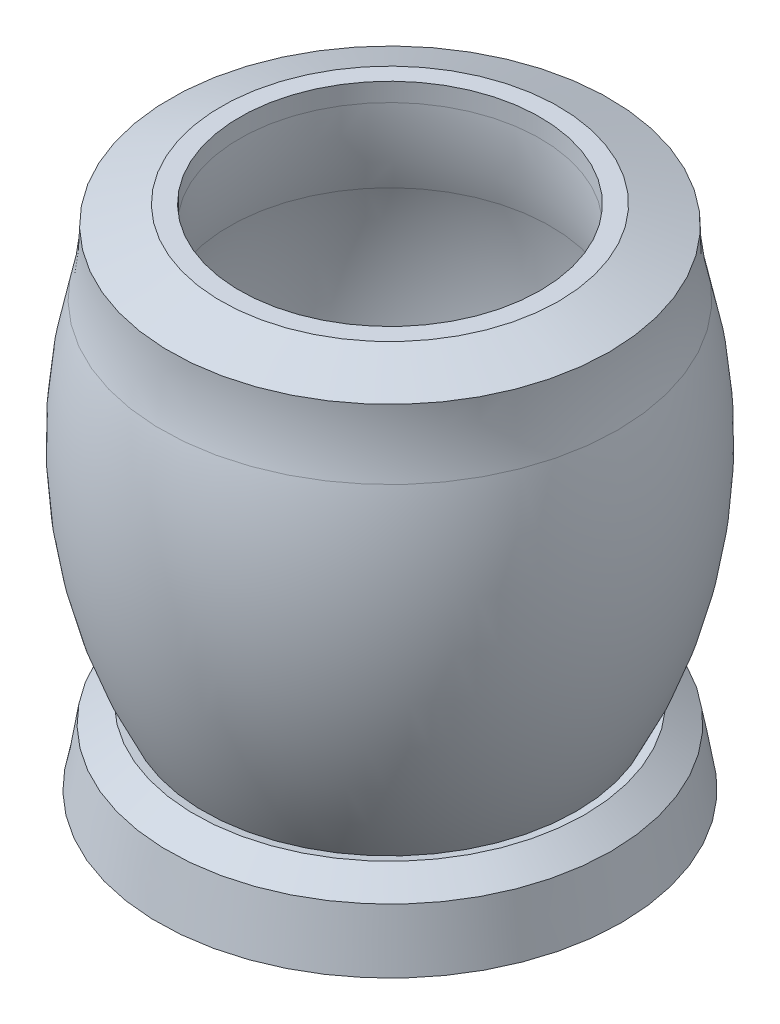
ISO-10303-21;
HEADER;
FILE_DESCRIPTION(('STEP AP214'),'2;1');
FILE_NAME('part.step','',(''),(''),'','','');
FILE_SCHEMA(('AUTOMOTIVE_DESIGN { 1 0 10303 214 1 1 1 1 }'));
ENDSEC;
DATA;
#1=APPLICATION_CONTEXT('core data for automotive mechanical design processes');
#2=APPLICATION_PROTOCOL_DEFINITION('international standard','automotive_design',2000,#1);
#3=PRODUCT_CONTEXT('',#1,'mechanical');
#4=PRODUCT('Part','Part','',(#3));
#5=PRODUCT_RELATED_PRODUCT_CATEGORY('part','',(#4));
#6=PRODUCT_DEFINITION_FORMATION('','',#4);
#7=PRODUCT_DEFINITION_CONTEXT('part definition',#1,'design');
#8=PRODUCT_DEFINITION('design','',#6,#7);
#9=PRODUCT_DEFINITION_SHAPE('','',#8);
#10=(LENGTH_UNIT() NAMED_UNIT(*) SI_UNIT(.MILLI.,.METRE.));
#11=(NAMED_UNIT(*) PLANE_ANGLE_UNIT() SI_UNIT($,.RADIAN.));
#12=(NAMED_UNIT(*) SI_UNIT($,.STERADIAN.) SOLID_ANGLE_UNIT());
#13=UNCERTAINTY_MEASURE_WITH_UNIT(LENGTH_MEASURE(1.E-05),#10,'distance_accuracy_value','');
#14=(GEOMETRIC_REPRESENTATION_CONTEXT(3) GLOBAL_UNCERTAINTY_ASSIGNED_CONTEXT((#13)) GLOBAL_UNIT_ASSIGNED_CONTEXT((#10,
#11,#12)) REPRESENTATION_CONTEXT('',''));
#15=CARTESIAN_POINT('',(0.,0.,0.));
#16=DIRECTION('',(0.,0.,1.));
#17=DIRECTION('',(1.,0.,0.));
#18=AXIS2_PLACEMENT_3D('',#15,#16,#17);
#19=CARTESIAN_POINT('',(0.,6.88073938927536,0.));
#20=DIRECTION('',(0.,1.,0.));
#21=DIRECTION('',(-1.,0.,0.));
#22=AXIS2_PLACEMENT_3D('',#19,#20,#21);
#23=CONICAL_SURFACE('',#22,3.937,1.39626340159546);
#24=CARTESIAN_POINT('',(0.,7.51509678354031,0.));
#25=DIRECTION('',(0.,-1.,0.));
#26=DIRECTION('',(1.,0.,0.));
#27=AXIS2_PLACEMENT_3D('',#24,#25,#26);
#28=CIRCLE('',#27,7.5346195572348);
#29=CARTESIAN_POINT('',(7.5346195572348,7.51509678354031,0.));
#30=VERTEX_POINT('',#29);
#31=EDGE_CURVE('E10',#30,#30,#28,.T.);
#32=ORIENTED_EDGE('',*,*,#31,.F.);
#33=EDGE_LOOP('',(#32));
#34=FACE_BOUND('',#33,.T.);
#35=CARTESIAN_POINT('',(0.,6.88073938927536,0.));
#36=DIRECTION('',(0.,-1.,0.));
#37=DIRECTION('',(1.,0.,0.));
#38=AXIS2_PLACEMENT_3D('',#35,#36,#37);
#39=CIRCLE('',#38,3.937);
#40=CARTESIAN_POINT('',(3.937,6.88073938927536,0.));
#41=VERTEX_POINT('',#40);
#42=EDGE_CURVE('E76',#41,#41,#39,.T.);
#43=ORIENTED_EDGE('',*,*,#42,.T.);
#44=EDGE_LOOP('',(#43));
#45=FACE_BOUND('',#44,.T.);
#46=ADVANCED_FACE('F33',(#34,#45),#23,.F.);
#47=CARTESIAN_POINT('',(0.,16.113042130845,0.));
#48=DIRECTION('',(0.,-1.,0.));
#49=DIRECTION('',(1.,0.,0.));
#50=AXIS2_PLACEMENT_3D('',#47,#48,#49);
#51=DEGENERATE_TOROIDAL_SURFACE('',#50,12.954,22.2195453499018,.F.);
#52=CARTESIAN_POINT('',(0.,21.6966178549877,0.));
#53=DIRECTION('',(0.,-1.,0.));
#54=DIRECTION('',(1.,0.,0.));
#55=AXIS2_PLACEMENT_3D('',#52,#53,#54);
#56=CIRCLE('',#55,8.55255429605372);
#57=CARTESIAN_POINT('',(8.55255429605372,21.6966178549877,0.));
#58=VERTEX_POINT('',#57);
#59=EDGE_CURVE('E39',#58,#58,#56,.T.);
#60=ORIENTED_EDGE('',*,*,#59,.F.);
#61=EDGE_LOOP('',(#60));
#62=FACE_BOUND('',#61,.T.);
#63=ORIENTED_EDGE('',*,*,#31,.T.);
#64=EDGE_LOOP('',(#63));
#65=FACE_BOUND('',#64,.T.);
#66=ADVANCED_FACE('F143',(#62,#65),#51,.T.);
#67=CARTESIAN_POINT('',(0.,26.01595,0.));
#68=DIRECTION('',(0.,-1.,0.));
#69=DIRECTION('',(1.,0.,0.));
#70=AXIS2_PLACEMENT_3D('',#67,#68,#69);
#71=TOROIDAL_SURFACE('',#70,25.1895546500982,17.1885546500982);
#72=CARTESIAN_POINT('',(0.,26.01595,0.));
#73=DIRECTION('',(0.,-1.,0.));
#74=DIRECTION('',(1.,0.,0.));
#75=AXIS2_PLACEMENT_3D('',#72,#73,#74);
#76=CIRCLE('',#75,8.001);
#77=CARTESIAN_POINT('',(8.001,26.01595,0.));
#78=VERTEX_POINT('',#77);
#79=EDGE_CURVE('E43',#78,#78,#76,.T.);
#80=ORIENTED_EDGE('',*,*,#79,.F.);
#81=EDGE_LOOP('',(#80));
#82=FACE_BOUND('',#81,.T.);
#83=ORIENTED_EDGE('',*,*,#59,.T.);
#84=EDGE_LOOP('',(#83));
#85=FACE_BOUND('',#84,.T.);
#86=ADVANCED_FACE('F138',(#82,#85),#71,.T.);
#87=CARTESIAN_POINT('',(0.,0.,0.));
#88=DIRECTION('',(0.,-1.,0.));
#89=DIRECTION('',(1.,0.,0.));
#90=AXIS2_PLACEMENT_3D('',#87,#88,#89);
#91=CYLINDRICAL_SURFACE('',#90,8.001);
#92=CARTESIAN_POINT('',(0.,27.0002,0.));
#93=DIRECTION('',(0.,-1.,0.));
#94=DIRECTION('',(1.,0.,0.));
#95=AXIS2_PLACEMENT_3D('',#92,#93,#94);
#96=CIRCLE('',#95,8.001);
#97=CARTESIAN_POINT('',(8.001,27.0002,0.));
#98=VERTEX_POINT('',#97);
#99=EDGE_CURVE('E47',#98,#98,#96,.T.);
#100=ORIENTED_EDGE('',*,*,#99,.F.);
#101=EDGE_LOOP('',(#100));
#102=FACE_BOUND('',#101,.T.);
#103=ORIENTED_EDGE('',*,*,#79,.T.);
#104=EDGE_LOOP('',(#103));
#105=FACE_BOUND('',#104,.T.);
#106=ADVANCED_FACE('F132',(#102,#105),#91,.F.);
#107=CARTESIAN_POINT('',(-8.98525,27.0002,0.));
#108=DIRECTION('',(0.,-1.,0.));
#109=DIRECTION('',(1.,0.,0.));
#110=AXIS2_PLACEMENT_3D('',#107,#108,#109);
#111=PLANE('',#110);
#112=CARTESIAN_POINT('',(0.,27.0002,0.));
#113=DIRECTION('',(0.,-1.,0.));
#114=DIRECTION('',(1.,0.,0.));
#115=AXIS2_PLACEMENT_3D('',#112,#113,#114);
#116=CIRCLE('',#115,8.98525);
#117=CARTESIAN_POINT('',(8.98525,27.0002,0.));
#118=VERTEX_POINT('',#117);
#119=EDGE_CURVE('E52',#118,#118,#116,.T.);
#120=ORIENTED_EDGE('',*,*,#119,.F.);
#121=EDGE_LOOP('',(#120));
#122=FACE_BOUND('',#121,.T.);
#123=ORIENTED_EDGE('',*,*,#99,.T.);
#124=EDGE_LOOP('',(#123));
#125=FACE_BOUND('',#124,.T.);
#126=ADVANCED_FACE('F126',(#122,#125),#111,.F.);
#127=CARTESIAN_POINT('',(0.,27.0002,0.));
#128=DIRECTION('',(0.,-1.,0.));
#129=DIRECTION('',(1.,0.,0.));
#130=AXIS2_PLACEMENT_3D('',#127,#128,#129);
#131=CONICAL_SURFACE('',#130,8.98525,1.22173047639603);
#132=CARTESIAN_POINT('',(0.,26.01595,0.));
#133=DIRECTION('',(0.,-1.,0.));
#134=DIRECTION('',(1.,0.,0.));
#135=AXIS2_PLACEMENT_3D('',#132,#133,#134);
#136=CIRCLE('',#135,11.6894546500982);
#137=CARTESIAN_POINT('',(11.6894546500982,26.01595,0.));
#138=VERTEX_POINT('',#137);
#139=EDGE_CURVE('E55',#138,#138,#136,.T.);
#140=ORIENTED_EDGE('',*,*,#139,.F.);
#141=EDGE_LOOP('',(#140));
#142=FACE_BOUND('',#141,.T.);
#143=ORIENTED_EDGE('',*,*,#119,.T.);
#144=EDGE_LOOP('',(#143));
#145=FACE_BOUND('',#144,.T.);
#146=ADVANCED_FACE('F120',(#142,#145),#131,.T.);
#147=CARTESIAN_POINT('',(0.,26.01595,0.));
#148=DIRECTION('',(0.,-1.,0.));
#149=DIRECTION('',(1.,0.,0.));
#150=AXIS2_PLACEMENT_3D('',#147,#148,#149);
#151=TOROIDAL_SURFACE('',#150,25.1895546500982,13.5001);
#152=CARTESIAN_POINT('',(0.,22.6234939687684,0.));
#153=DIRECTION('',(0.,-1.,0.));
#154=DIRECTION('',(1.,0.,0.));
#155=AXIS2_PLACEMENT_3D('',#152,#153,#154);
#156=CIRCLE('',#155,12.1226521064133);
#157=CARTESIAN_POINT('',(12.1226521064133,22.6234939687684,0.));
#158=VERTEX_POINT('',#157);
#159=EDGE_CURVE('E58',#158,#158,#156,.T.);
#160=ORIENTED_EDGE('',*,*,#159,.F.);
#161=EDGE_LOOP('',(#160));
#162=FACE_BOUND('',#161,.T.);
#163=ORIENTED_EDGE('',*,*,#139,.T.);
#164=EDGE_LOOP('',(#163));
#165=FACE_BOUND('',#164,.T.);
#166=ADVANCED_FACE('F114',(#162,#165),#151,.F.);
#167=CARTESIAN_POINT('',(0.,16.113042130845,0.));
#168=DIRECTION('',(0.,-1.,0.));
#169=DIRECTION('',(1.,0.,0.));
#170=AXIS2_PLACEMENT_3D('',#167,#168,#169);
#171=DEGENERATE_TOROIDAL_SURFACE('',#170,12.954,25.908,.F.);
#172=CARTESIAN_POINT('',(0.,3.937,0.));
#173=DIRECTION('',(0.,-1.,0.));
#174=DIRECTION('',(1.,0.,0.));
#175=AXIS2_PLACEMENT_3D('',#172,#173,#174);
#176=CIRCLE('',#175,9.91450371204657);
#177=CARTESIAN_POINT('',(9.91450371204657,3.937,0.));
#178=VERTEX_POINT('',#177);
#179=EDGE_CURVE('E61',#178,#178,#176,.T.);
#180=ORIENTED_EDGE('',*,*,#179,.F.);
#181=EDGE_LOOP('',(#180));
#182=FACE_BOUND('',#181,.T.);
#183=ORIENTED_EDGE('',*,*,#159,.T.);
#184=EDGE_LOOP('',(#183));
#185=FACE_BOUND('',#184,.T.);
#186=ADVANCED_FACE('F108',(#182,#185),#171,.F.);
#187=CARTESIAN_POINT('',(0.,3.937,0.));
#188=DIRECTION('',(0.,1.,0.));
#189=DIRECTION('',(-1.,0.,0.));
#190=AXIS2_PLACEMENT_3D('',#187,#188,#189);
#191=CONICAL_SURFACE('',#190,9.91450371204657,1.39626340159546);
#192=CARTESIAN_POINT('',(0.,4.01877566871503,0.));
#193=DIRECTION('',(0.,-1.,0.));
#194=DIRECTION('',(1.,0.,0.));
#195=AXIS2_PLACEMENT_3D('',#192,#193,#194);
#196=CIRCLE('',#195,10.3782765753172);
#197=CARTESIAN_POINT('',(10.3782765753172,4.01877566871503,0.));
#198=VERTEX_POINT('',#197);
#199=EDGE_CURVE('E64',#198,#198,#196,.T.);
#200=ORIENTED_EDGE('',*,*,#199,.F.);
#201=EDGE_LOOP('',(#200));
#202=FACE_BOUND('',#201,.T.);
#203=ORIENTED_EDGE('',*,*,#179,.T.);
#204=EDGE_LOOP('',(#203));
#205=FACE_BOUND('',#204,.T.);
#206=ADVANCED_FACE('F102',(#202,#205),#191,.F.);
#207=CARTESIAN_POINT('',(0.,4.01877566871503,0.));
#208=DIRECTION('',(0.,-1.,0.));
#209=DIRECTION('',(1.,0.,0.));
#210=AXIS2_PLACEMENT_3D('',#207,#208,#209);
#211=CONICAL_SURFACE('',#210,10.3782765753172,0.959931088596888);
#212=CARTESIAN_POINT('',(0.,3.03452566871503,0.));
#213=DIRECTION('',(0.,-1.,0.));
#214=DIRECTION('',(1.,0.,0.));
#215=AXIS2_PLACEMENT_3D('',#212,#213,#214);
#216=CIRCLE('',#215,11.7839312509531);
#217=CARTESIAN_POINT('',(11.7839312509531,3.03452566871503,0.));
#218=VERTEX_POINT('',#217);
#219=EDGE_CURVE('E67',#218,#218,#216,.T.);
#220=ORIENTED_EDGE('',*,*,#219,.F.);
#221=EDGE_LOOP('',(#220));
#222=FACE_BOUND('',#221,.T.);
#223=ORIENTED_EDGE('',*,*,#199,.T.);
#224=EDGE_LOOP('',(#223));
#225=FACE_BOUND('',#224,.T.);
#226=ADVANCED_FACE('F96',(#222,#225),#211,.T.);
#227=CARTESIAN_POINT('',(0.,3.03452566871503,0.));
#228=DIRECTION('',(0.,-1.,0.));
#229=DIRECTION('',(1.,0.,0.));
#230=AXIS2_PLACEMENT_3D('',#227,#228,#229);
#231=CONICAL_SURFACE('',#230,11.7839312509531,0.174532925199438);
#232=CARTESIAN_POINT('',(0.,0.,0.));
#233=DIRECTION('',(0.,-1.,0.));
#234=DIRECTION('',(1.,0.,0.));
#235=AXIS2_PLACEMENT_3D('',#232,#233,#234);
#236=CIRCLE('',#235,12.319);
#237=CARTESIAN_POINT('',(12.319,0.,0.));
#238=VERTEX_POINT('',#237);
#239=EDGE_CURVE('E70',#238,#238,#236,.T.);
#240=ORIENTED_EDGE('',*,*,#239,.F.);
#241=EDGE_LOOP('',(#240));
#242=FACE_BOUND('',#241,.T.);
#243=ORIENTED_EDGE('',*,*,#219,.T.);
#244=EDGE_LOOP('',(#243));
#245=FACE_BOUND('',#244,.T.);
#246=ADVANCED_FACE('F90',(#242,#245),#231,.T.);
#247=CARTESIAN_POINT('',(-3.937,0.,0.));
#248=DIRECTION('',(0.,1.,0.));
#249=DIRECTION('',(-1.,0.,0.));
#250=AXIS2_PLACEMENT_3D('',#247,#248,#249);
#251=PLANE('',#250);
#252=CARTESIAN_POINT('',(0.,0.,0.));
#253=DIRECTION('',(0.,-1.,0.));
#254=DIRECTION('',(1.,0.,0.));
#255=AXIS2_PLACEMENT_3D('',#252,#253,#254);
#256=CIRCLE('',#255,3.937);
#257=CARTESIAN_POINT('',(3.937,0.,0.));
#258=VERTEX_POINT('',#257);
#259=EDGE_CURVE('E73',#258,#258,#256,.T.);
#260=ORIENTED_EDGE('',*,*,#259,.F.);
#261=EDGE_LOOP('',(#260));
#262=FACE_BOUND('',#261,.T.);
#263=ORIENTED_EDGE('',*,*,#239,.T.);
#264=EDGE_LOOP('',(#263));
#265=FACE_BOUND('',#264,.T.);
#266=ADVANCED_FACE('F84',(#262,#265),#251,.F.);
#267=CARTESIAN_POINT('',(0.,0.,0.));
#268=DIRECTION('',(0.,-1.,0.));
#269=DIRECTION('',(1.,0.,0.));
#270=AXIS2_PLACEMENT_3D('',#267,#268,#269);
#271=CYLINDRICAL_SURFACE('',#270,3.937);
#272=ORIENTED_EDGE('',*,*,#42,.F.);
#273=EDGE_LOOP('',(#272));
#274=FACE_BOUND('',#273,.T.);
#275=ORIENTED_EDGE('',*,*,#259,.T.);
#276=EDGE_LOOP('',(#275));
#277=FACE_BOUND('',#276,.T.);
#278=ADVANCED_FACE('F81',(#274,#277),#271,.F.);
#279=CLOSED_SHELL('',(#46,#66,#86,#106,#126,#146,#166,#186,#206,#226,#246,#266,#278));
#280=MANIFOLD_SOLID_BREP('B2',#279);
#281=ADVANCED_BREP_SHAPE_REPRESENTATION('',(#18,#280),#14);
#282=SHAPE_DEFINITION_REPRESENTATION(#9,#281);
ENDSEC;
END-ISO-10303-21;
